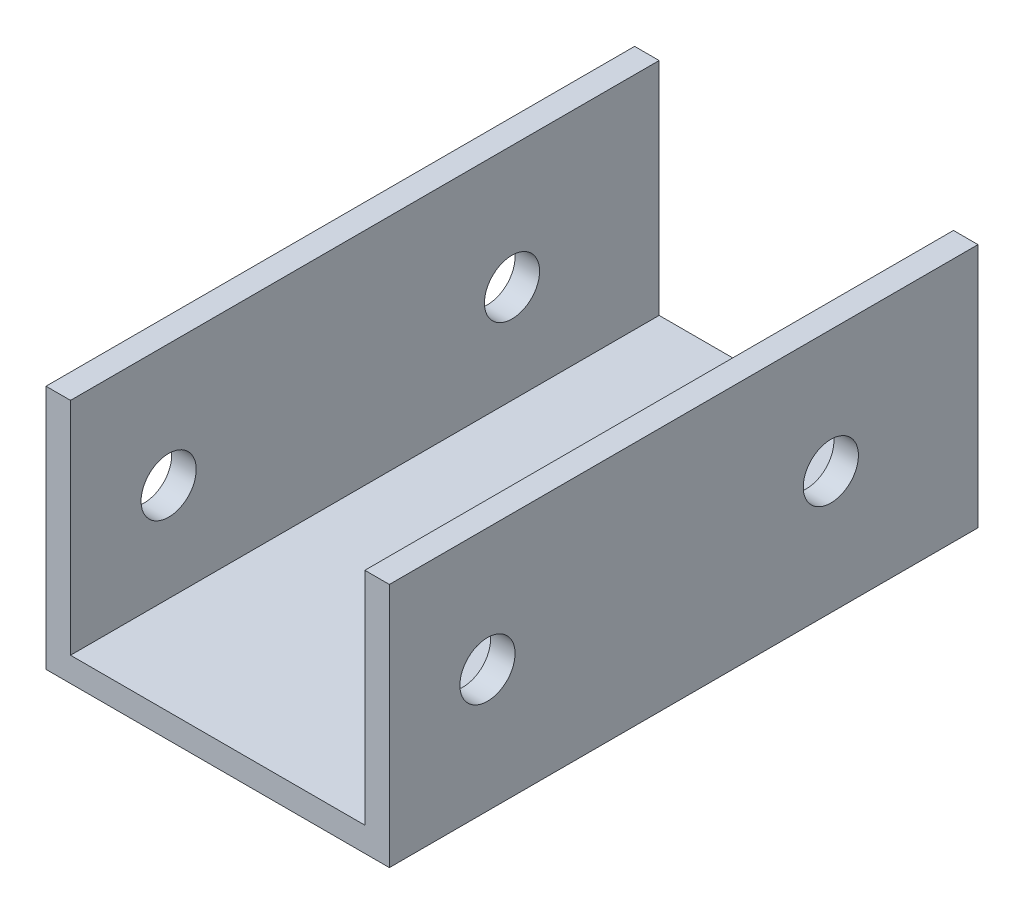
ISO-10303-21;
HEADER;
FILE_DESCRIPTION(('STEP AP214'),'2;1');
FILE_NAME('part.step','',(''),(''),'','','');
FILE_SCHEMA(('AUTOMOTIVE_DESIGN { 1 0 10303 214 1 1 1 1 }'));
ENDSEC;
DATA;
#1=APPLICATION_CONTEXT('core data for automotive mechanical design processes');
#2=APPLICATION_PROTOCOL_DEFINITION('international standard','automotive_design',2000,#1);
#3=PRODUCT_CONTEXT('',#1,'mechanical');
#4=PRODUCT('Part','Part','',(#3));
#5=PRODUCT_RELATED_PRODUCT_CATEGORY('part','',(#4));
#6=PRODUCT_DEFINITION_FORMATION('','',#4);
#7=PRODUCT_DEFINITION_CONTEXT('part definition',#1,'design');
#8=PRODUCT_DEFINITION('design','',#6,#7);
#9=PRODUCT_DEFINITION_SHAPE('','',#8);
#10=(LENGTH_UNIT() NAMED_UNIT(*) SI_UNIT(.MILLI.,.METRE.));
#11=(NAMED_UNIT(*) PLANE_ANGLE_UNIT() SI_UNIT($,.RADIAN.));
#12=(NAMED_UNIT(*) SI_UNIT($,.STERADIAN.) SOLID_ANGLE_UNIT());
#13=UNCERTAINTY_MEASURE_WITH_UNIT(LENGTH_MEASURE(1.E-05),#10,'distance_accuracy_value','');
#14=(GEOMETRIC_REPRESENTATION_CONTEXT(3) GLOBAL_UNCERTAINTY_ASSIGNED_CONTEXT((#13)) GLOBAL_UNIT_ASSIGNED_CONTEXT((#10,
#11,#12)) REPRESENTATION_CONTEXT('',''));
#15=CARTESIAN_POINT('',(0.,0.,0.));
#16=DIRECTION('',(0.,0.,1.));
#17=DIRECTION('',(1.,0.,0.));
#18=AXIS2_PLACEMENT_3D('',#15,#16,#17);
#19=CARTESIAN_POINT('',(0.,15.875,76.2));
#20=DIRECTION('',(0.,1.,0.));
#21=DIRECTION('',(0.,0.,1.));
#22=AXIS2_PLACEMENT_3D('',#19,#20,#21);
#23=PLANE('',#22);
#24=DIRECTION('',(1.,0.,0.));
#25=VECTOR('',#24,1.);
#26=CARTESIAN_POINT('',(0.,15.875,0.));
#27=LINE('',#26,#25);
#28=CARTESIAN_POINT('',(19.05,15.875,0.));
#29=VERTEX_POINT('',#28);
#30=CARTESIAN_POINT('',(22.225,15.875,0.));
#31=VERTEX_POINT('',#30);
#32=EDGE_CURVE('E138',#29,#31,#27,.T.);
#33=ORIENTED_EDGE('',*,*,#32,.F.);
#34=DIRECTION('',(0.,0.,-1.));
#35=VECTOR('',#34,1.);
#36=CARTESIAN_POINT('',(19.05,15.875,76.2));
#37=LINE('',#36,#35);
#38=CARTESIAN_POINT('',(19.05,15.875,76.2));
#39=VERTEX_POINT('',#38);
#40=EDGE_CURVE('E11',#39,#29,#37,.T.);
#41=ORIENTED_EDGE('',*,*,#40,.F.);
#42=DIRECTION('',(1.,0.,0.));
#43=VECTOR('',#42,1.);
#44=CARTESIAN_POINT('',(0.,15.875,76.2));
#45=LINE('',#44,#43);
#46=CARTESIAN_POINT('',(22.225,15.875,76.2));
#47=VERTEX_POINT('',#46);
#48=EDGE_CURVE('E157',#39,#47,#45,.T.);
#49=ORIENTED_EDGE('',*,*,#48,.T.);
#50=DIRECTION('',(0.,0.,-1.));
#51=VECTOR('',#50,1.);
#52=CARTESIAN_POINT('',(22.225,15.875,76.2));
#53=LINE('',#52,#51);
#54=EDGE_CURVE('E60',#47,#31,#53,.T.);
#55=ORIENTED_EDGE('',*,*,#54,.T.);
#56=EDGE_LOOP('',(#33,#41,#49,#55));
#57=FACE_BOUND('',#56,.T.);
#58=ADVANCED_FACE('F43',(#57),#23,.T.);
#59=CARTESIAN_POINT('',(19.05,0.,76.2));
#60=DIRECTION('',(1.,0.,0.));
#61=DIRECTION('',(0.,1.,0.));
#62=AXIS2_PLACEMENT_3D('',#59,#60,#61);
#63=PLANE('',#62);
#64=CARTESIAN_POINT('',(19.05,0.,63.5));
#65=DIRECTION('',(1.,0.,0.));
#66=DIRECTION('',(0.,1.,0.));
#67=AXIS2_PLACEMENT_3D('',#64,#65,#66);
#68=CIRCLE('',#67,3.57123999999999);
#69=CARTESIAN_POINT('',(19.05,3.57123999999999,63.5));
#70=VERTEX_POINT('',#69);
#71=EDGE_CURVE('E198',#70,#70,#68,.T.);
#72=ORIENTED_EDGE('',*,*,#71,.T.);
#73=EDGE_LOOP('',(#72));
#74=FACE_BOUND('',#73,.T.);
#75=CARTESIAN_POINT('',(19.05,0.,19.05));
#76=DIRECTION('',(1.,0.,0.));
#77=DIRECTION('',(0.,1.,0.));
#78=AXIS2_PLACEMENT_3D('',#75,#76,#77);
#79=CIRCLE('',#78,3.57123999999999);
#80=CARTESIAN_POINT('',(19.05,3.57123999999999,19.05));
#81=VERTEX_POINT('',#80);
#82=EDGE_CURVE('E141',#81,#81,#79,.T.);
#83=ORIENTED_EDGE('',*,*,#82,.T.);
#84=EDGE_LOOP('',(#83));
#85=FACE_BOUND('',#84,.T.);
#86=DIRECTION('',(0.,-1.,0.));
#87=VECTOR('',#86,1.);
#88=CARTESIAN_POINT('',(19.05,0.,0.));
#89=LINE('',#88,#87);
#90=CARTESIAN_POINT('',(19.05,-12.7,0.));
#91=VERTEX_POINT('',#90);
#92=EDGE_CURVE('E140',#29,#91,#89,.T.);
#93=ORIENTED_EDGE('',*,*,#92,.T.);
#94=DIRECTION('',(0.,0.,-1.));
#95=VECTOR('',#94,1.);
#96=CARTESIAN_POINT('',(19.05,-12.7,76.2));
#97=LINE('',#96,#95);
#98=CARTESIAN_POINT('',(19.05,-12.7,76.2));
#99=VERTEX_POINT('',#98);
#100=EDGE_CURVE('E52',#99,#91,#97,.T.);
#101=ORIENTED_EDGE('',*,*,#100,.F.);
#102=DIRECTION('',(0.,-1.,0.));
#103=VECTOR('',#102,1.);
#104=CARTESIAN_POINT('',(19.05,0.,76.2));
#105=LINE('',#104,#103);
#106=EDGE_CURVE('E182',#39,#99,#105,.T.);
#107=ORIENTED_EDGE('',*,*,#106,.F.);
#108=ORIENTED_EDGE('',*,*,#40,.T.);
#109=EDGE_LOOP('',(#93,#101,#107,#108));
#110=FACE_BOUND('',#109,.T.);
#111=ADVANCED_FACE('F45',(#74,#85,#110),#63,.F.);
#112=CARTESIAN_POINT('',(0.,-12.7,76.2));
#113=DIRECTION('',(0.,1.,0.));
#114=DIRECTION('',(0.,0.,1.));
#115=AXIS2_PLACEMENT_3D('',#112,#113,#114);
#116=PLANE('',#115);
#117=DIRECTION('',(1.,0.,0.));
#118=VECTOR('',#117,1.);
#119=CARTESIAN_POINT('',(0.,-12.7,0.));
#120=LINE('',#119,#118);
#121=CARTESIAN_POINT('',(-19.05,-12.7,0.));
#122=VERTEX_POINT('',#121);
#123=EDGE_CURVE('E145',#122,#91,#120,.T.);
#124=ORIENTED_EDGE('',*,*,#123,.F.);
#125=DIRECTION('',(0.,0.,-1.));
#126=VECTOR('',#125,1.);
#127=CARTESIAN_POINT('',(-19.05,-12.7,76.2));
#128=LINE('',#127,#126);
#129=CARTESIAN_POINT('',(-19.05,-12.7,76.2));
#130=VERTEX_POINT('',#129);
#131=EDGE_CURVE('E163',#130,#122,#128,.T.);
#132=ORIENTED_EDGE('',*,*,#131,.F.);
#133=DIRECTION('',(1.,0.,0.));
#134=VECTOR('',#133,1.);
#135=CARTESIAN_POINT('',(0.,-12.7,76.2));
#136=LINE('',#135,#134);
#137=EDGE_CURVE('E170',#130,#99,#136,.T.);
#138=ORIENTED_EDGE('',*,*,#137,.T.);
#139=ORIENTED_EDGE('',*,*,#100,.T.);
#140=EDGE_LOOP('',(#124,#132,#138,#139));
#141=FACE_BOUND('',#140,.T.);
#142=ADVANCED_FACE('F168',(#141),#116,.T.);
#143=CARTESIAN_POINT('',(-19.05,0.,76.2));
#144=DIRECTION('',(1.,0.,0.));
#145=DIRECTION('',(0.,1.,0.));
#146=AXIS2_PLACEMENT_3D('',#143,#144,#145);
#147=PLANE('',#146);
#148=CARTESIAN_POINT('',(-19.05,0.,63.5));
#149=DIRECTION('',(1.,0.,0.));
#150=DIRECTION('',(0.,1.,0.));
#151=AXIS2_PLACEMENT_3D('',#148,#149,#150);
#152=CIRCLE('',#151,3.57123999999999);
#153=CARTESIAN_POINT('',(-19.05,3.57123999999999,63.5));
#154=VERTEX_POINT('',#153);
#155=EDGE_CURVE('E201',#154,#154,#152,.T.);
#156=ORIENTED_EDGE('',*,*,#155,.F.);
#157=EDGE_LOOP('',(#156));
#158=FACE_BOUND('',#157,.T.);
#159=CARTESIAN_POINT('',(-19.05,0.,19.05));
#160=DIRECTION('',(1.,0.,0.));
#161=DIRECTION('',(0.,1.,0.));
#162=AXIS2_PLACEMENT_3D('',#159,#160,#161);
#163=CIRCLE('',#162,3.57123999999999);
#164=CARTESIAN_POINT('',(-19.05,3.57123999999999,19.05));
#165=VERTEX_POINT('',#164);
#166=EDGE_CURVE('E189',#165,#165,#163,.T.);
#167=ORIENTED_EDGE('',*,*,#166,.F.);
#168=EDGE_LOOP('',(#167));
#169=FACE_BOUND('',#168,.T.);
#170=DIRECTION('',(0.,-1.,0.));
#171=VECTOR('',#170,1.);
#172=CARTESIAN_POINT('',(-19.05,0.,0.));
#173=LINE('',#172,#171);
#174=CARTESIAN_POINT('',(-19.05,15.875,0.));
#175=VERTEX_POINT('',#174);
#176=EDGE_CURVE('E148',#175,#122,#173,.T.);
#177=ORIENTED_EDGE('',*,*,#176,.F.);
#178=DIRECTION('',(0.,0.,-1.));
#179=VECTOR('',#178,1.);
#180=CARTESIAN_POINT('',(-19.05,15.875,76.2));
#181=LINE('',#180,#179);
#182=CARTESIAN_POINT('',(-19.05,15.875,76.2));
#183=VERTEX_POINT('',#182);
#184=EDGE_CURVE('E161',#183,#175,#181,.T.);
#185=ORIENTED_EDGE('',*,*,#184,.F.);
#186=DIRECTION('',(0.,-1.,0.));
#187=VECTOR('',#186,1.);
#188=CARTESIAN_POINT('',(-19.05,0.,76.2));
#189=LINE('',#188,#187);
#190=EDGE_CURVE('E181',#183,#130,#189,.T.);
#191=ORIENTED_EDGE('',*,*,#190,.T.);
#192=ORIENTED_EDGE('',*,*,#131,.T.);
#193=EDGE_LOOP('',(#177,#185,#191,#192));
#194=FACE_BOUND('',#193,.T.);
#195=ADVANCED_FACE('F179',(#158,#169,#194),#147,.T.);
#196=CARTESIAN_POINT('',(-22.225,15.875,0.));
#197=VERTEX_POINT('',#196);
#198=EDGE_CURVE('E142',#197,#175,#27,.T.);
#199=ORIENTED_EDGE('',*,*,#198,.F.);
#200=DIRECTION('',(0.,0.,-1.));
#201=VECTOR('',#200,1.);
#202=CARTESIAN_POINT('',(-22.225,15.875,76.2));
#203=LINE('',#202,#201);
#204=CARTESIAN_POINT('',(-22.225,15.875,76.2));
#205=VERTEX_POINT('',#204);
#206=EDGE_CURVE('E130',#205,#197,#203,.T.);
#207=ORIENTED_EDGE('',*,*,#206,.F.);
#208=EDGE_CURVE('E120',#205,#183,#45,.T.);
#209=ORIENTED_EDGE('',*,*,#208,.T.);
#210=ORIENTED_EDGE('',*,*,#184,.T.);
#211=EDGE_LOOP('',(#199,#207,#209,#210));
#212=FACE_BOUND('',#211,.T.);
#213=ADVANCED_FACE('F221',(#212),#23,.T.);
#214=CARTESIAN_POINT('',(-22.225,0.,76.2));
#215=DIRECTION('',(1.,0.,0.));
#216=DIRECTION('',(0.,1.,0.));
#217=AXIS2_PLACEMENT_3D('',#214,#215,#216);
#218=PLANE('',#217);
#219=CARTESIAN_POINT('',(-22.225,0.,63.5));
#220=DIRECTION('',(1.,0.,0.));
#221=DIRECTION('',(0.,0.,-1.));
#222=AXIS2_PLACEMENT_3D('',#219,#220,#221);
#223=CIRCLE('',#222,3.57123999999999);
#224=CARTESIAN_POINT('',(-22.225,0.,59.92876));
#225=VERTEX_POINT('',#224);
#226=EDGE_CURVE('E204',#225,#225,#223,.T.);
#227=ORIENTED_EDGE('',*,*,#226,.T.);
#228=EDGE_LOOP('',(#227));
#229=FACE_BOUND('',#228,.T.);
#230=CARTESIAN_POINT('',(-22.225,0.,19.05));
#231=DIRECTION('',(1.,0.,0.));
#232=DIRECTION('',(0.,0.,-1.));
#233=AXIS2_PLACEMENT_3D('',#230,#231,#232);
#234=CIRCLE('',#233,3.57123999999999);
#235=CARTESIAN_POINT('',(-22.225,0.,15.47876));
#236=VERTEX_POINT('',#235);
#237=EDGE_CURVE('E192',#236,#236,#234,.T.);
#238=ORIENTED_EDGE('',*,*,#237,.T.);
#239=EDGE_LOOP('',(#238));
#240=FACE_BOUND('',#239,.T.);
#241=DIRECTION('',(0.,-1.,0.));
#242=VECTOR('',#241,1.);
#243=CARTESIAN_POINT('',(-22.225,0.,0.));
#244=LINE('',#243,#242);
#245=CARTESIAN_POINT('',(-22.225,-15.875,0.));
#246=VERTEX_POINT('',#245);
#247=EDGE_CURVE('E127',#197,#246,#244,.T.);
#248=ORIENTED_EDGE('',*,*,#247,.T.);
#249=DIRECTION('',(0.,0.,-1.));
#250=VECTOR('',#249,1.);
#251=CARTESIAN_POINT('',(-22.225,-15.875,76.2));
#252=LINE('',#251,#250);
#253=CARTESIAN_POINT('',(-22.225,-15.875,76.2));
#254=VERTEX_POINT('',#253);
#255=EDGE_CURVE('E124',#254,#246,#252,.T.);
#256=ORIENTED_EDGE('',*,*,#255,.F.);
#257=DIRECTION('',(0.,-1.,0.));
#258=VECTOR('',#257,1.);
#259=CARTESIAN_POINT('',(-22.225,0.,76.2));
#260=LINE('',#259,#258);
#261=EDGE_CURVE('E111',#205,#254,#260,.T.);
#262=ORIENTED_EDGE('',*,*,#261,.F.);
#263=ORIENTED_EDGE('',*,*,#206,.T.);
#264=EDGE_LOOP('',(#248,#256,#262,#263));
#265=FACE_BOUND('',#264,.T.);
#266=ADVANCED_FACE('F125',(#229,#240,#265),#218,.F.);
#267=CARTESIAN_POINT('',(0.,-15.875,76.2));
#268=DIRECTION('',(0.,1.,0.));
#269=DIRECTION('',(0.,0.,1.));
#270=AXIS2_PLACEMENT_3D('',#267,#268,#269);
#271=PLANE('',#270);
#272=DIRECTION('',(1.,0.,0.));
#273=VECTOR('',#272,1.);
#274=CARTESIAN_POINT('',(0.,-15.875,0.));
#275=LINE('',#274,#273);
#276=CARTESIAN_POINT('',(22.225,-15.875,0.));
#277=VERTEX_POINT('',#276);
#278=EDGE_CURVE('E152',#246,#277,#275,.T.);
#279=ORIENTED_EDGE('',*,*,#278,.T.);
#280=DIRECTION('',(0.,0.,-1.));
#281=VECTOR('',#280,1.);
#282=CARTESIAN_POINT('',(22.225,-15.875,76.2));
#283=LINE('',#282,#281);
#284=CARTESIAN_POINT('',(22.225,-15.875,76.2));
#285=VERTEX_POINT('',#284);
#286=EDGE_CURVE('E86',#285,#277,#283,.T.);
#287=ORIENTED_EDGE('',*,*,#286,.F.);
#288=DIRECTION('',(1.,0.,0.));
#289=VECTOR('',#288,1.);
#290=CARTESIAN_POINT('',(0.,-15.875,76.2));
#291=LINE('',#290,#289);
#292=EDGE_CURVE('E117',#254,#285,#291,.T.);
#293=ORIENTED_EDGE('',*,*,#292,.F.);
#294=ORIENTED_EDGE('',*,*,#255,.T.);
#295=EDGE_LOOP('',(#279,#287,#293,#294));
#296=FACE_BOUND('',#295,.T.);
#297=ADVANCED_FACE('F132',(#296),#271,.F.);
#298=CARTESIAN_POINT('',(22.225,0.,76.2));
#299=DIRECTION('',(1.,0.,0.));
#300=DIRECTION('',(0.,1.,0.));
#301=AXIS2_PLACEMENT_3D('',#298,#299,#300);
#302=PLANE('',#301);
#303=CARTESIAN_POINT('',(22.225,0.,63.5));
#304=DIRECTION('',(1.,0.,0.));
#305=DIRECTION('',(0.,0.,-1.));
#306=AXIS2_PLACEMENT_3D('',#303,#304,#305);
#307=CIRCLE('',#306,3.57123999999999);
#308=CARTESIAN_POINT('',(22.225,0.,59.92876));
#309=VERTEX_POINT('',#308);
#310=EDGE_CURVE('E207',#309,#309,#307,.T.);
#311=ORIENTED_EDGE('',*,*,#310,.F.);
#312=EDGE_LOOP('',(#311));
#313=FACE_BOUND('',#312,.T.);
#314=CARTESIAN_POINT('',(22.225,0.,19.05));
#315=DIRECTION('',(1.,0.,0.));
#316=DIRECTION('',(0.,0.,-1.));
#317=AXIS2_PLACEMENT_3D('',#314,#315,#316);
#318=CIRCLE('',#317,3.57123999999999);
#319=CARTESIAN_POINT('',(22.225,0.,15.47876));
#320=VERTEX_POINT('',#319);
#321=EDGE_CURVE('E195',#320,#320,#318,.T.);
#322=ORIENTED_EDGE('',*,*,#321,.F.);
#323=EDGE_LOOP('',(#322));
#324=FACE_BOUND('',#323,.T.);
#325=DIRECTION('',(0.,-1.,0.));
#326=VECTOR('',#325,1.);
#327=CARTESIAN_POINT('',(22.225,0.,0.));
#328=LINE('',#327,#326);
#329=EDGE_CURVE('E154',#31,#277,#328,.T.);
#330=ORIENTED_EDGE('',*,*,#329,.F.);
#331=ORIENTED_EDGE('',*,*,#54,.F.);
#332=DIRECTION('',(0.,-1.,0.));
#333=VECTOR('',#332,1.);
#334=CARTESIAN_POINT('',(22.225,0.,76.2));
#335=LINE('',#334,#333);
#336=EDGE_CURVE('E133',#47,#285,#335,.T.);
#337=ORIENTED_EDGE('',*,*,#336,.T.);
#338=ORIENTED_EDGE('',*,*,#286,.T.);
#339=EDGE_LOOP('',(#330,#331,#337,#338));
#340=FACE_BOUND('',#339,.T.);
#341=ADVANCED_FACE('F214',(#313,#324,#340),#302,.T.);
#342=CARTESIAN_POINT('',(0.,0.,76.2));
#343=DIRECTION('',(0.,0.,1.));
#344=DIRECTION('',(1.,0.,0.));
#345=AXIS2_PLACEMENT_3D('',#342,#343,#344);
#346=PLANE('',#345);
#347=ORIENTED_EDGE('',*,*,#48,.F.);
#348=ORIENTED_EDGE('',*,*,#106,.T.);
#349=ORIENTED_EDGE('',*,*,#137,.F.);
#350=ORIENTED_EDGE('',*,*,#190,.F.);
#351=ORIENTED_EDGE('',*,*,#208,.F.);
#352=ORIENTED_EDGE('',*,*,#261,.T.);
#353=ORIENTED_EDGE('',*,*,#292,.T.);
#354=ORIENTED_EDGE('',*,*,#336,.F.);
#355=EDGE_LOOP('',(#347,#348,#349,#350,#351,#352,#353,#354));
#356=FACE_BOUND('',#355,.T.);
#357=ADVANCED_FACE('F114',(#356),#346,.T.);
#358=CARTESIAN_POINT('',(0.,0.,0.));
#359=DIRECTION('',(0.,0.,1.));
#360=DIRECTION('',(1.,0.,0.));
#361=AXIS2_PLACEMENT_3D('',#358,#359,#360);
#362=PLANE('',#361);
#363=ORIENTED_EDGE('',*,*,#32,.T.);
#364=ORIENTED_EDGE('',*,*,#329,.T.);
#365=ORIENTED_EDGE('',*,*,#278,.F.);
#366=ORIENTED_EDGE('',*,*,#247,.F.);
#367=ORIENTED_EDGE('',*,*,#198,.T.);
#368=ORIENTED_EDGE('',*,*,#176,.T.);
#369=ORIENTED_EDGE('',*,*,#123,.T.);
#370=ORIENTED_EDGE('',*,*,#92,.F.);
#371=EDGE_LOOP('',(#363,#364,#365,#366,#367,#368,#369,#370));
#372=FACE_BOUND('',#371,.T.);
#373=ADVANCED_FACE('F174',(#372),#362,.F.);
#374=CARTESIAN_POINT('',(22.225,0.,19.05));
#375=DIRECTION('',(1.,0.,0.));
#376=DIRECTION('',(0.,0.,-1.));
#377=AXIS2_PLACEMENT_3D('',#374,#375,#376);
#378=CYLINDRICAL_SURFACE('',#377,3.57123999999999);
#379=ORIENTED_EDGE('',*,*,#321,.T.);
#380=EDGE_LOOP('',(#379));
#381=FACE_BOUND('',#380,.T.);
#382=ORIENTED_EDGE('',*,*,#82,.F.);
#383=EDGE_LOOP('',(#382));
#384=FACE_BOUND('',#383,.T.);
#385=ADVANCED_FACE('F248',(#381,#384),#378,.F.);
#386=ORIENTED_EDGE('',*,*,#166,.T.);
#387=EDGE_LOOP('',(#386));
#388=FACE_BOUND('',#387,.T.);
#389=ORIENTED_EDGE('',*,*,#237,.F.);
#390=EDGE_LOOP('',(#389));
#391=FACE_BOUND('',#390,.T.);
#392=ADVANCED_FACE('F244',(#388,#391),#378,.F.);
#393=CARTESIAN_POINT('',(22.225,0.,63.5));
#394=DIRECTION('',(1.,0.,0.));
#395=DIRECTION('',(0.,0.,-1.));
#396=AXIS2_PLACEMENT_3D('',#393,#394,#395);
#397=CYLINDRICAL_SURFACE('',#396,3.57123999999999);
#398=ORIENTED_EDGE('',*,*,#155,.T.);
#399=EDGE_LOOP('',(#398));
#400=FACE_BOUND('',#399,.T.);
#401=ORIENTED_EDGE('',*,*,#226,.F.);
#402=EDGE_LOOP('',(#401));
#403=FACE_BOUND('',#402,.T.);
#404=ADVANCED_FACE('F247',(#400,#403),#397,.F.);
#405=ORIENTED_EDGE('',*,*,#310,.T.);
#406=EDGE_LOOP('',(#405));
#407=FACE_BOUND('',#406,.T.);
#408=ORIENTED_EDGE('',*,*,#71,.F.);
#409=EDGE_LOOP('',(#408));
#410=FACE_BOUND('',#409,.T.);
#411=ADVANCED_FACE('F211',(#407,#410),#397,.F.);
#412=CLOSED_SHELL('',(#58,#111,#142,#195,#213,#266,#297,#341,#357,#373,#385,#392,#404,#411));
#413=MANIFOLD_SOLID_BREP('B2',#412);
#414=ADVANCED_BREP_SHAPE_REPRESENTATION('',(#18,#413),#14);
#415=SHAPE_DEFINITION_REPRESENTATION(#9,#414);
ENDSEC;
END-ISO-10303-21;
